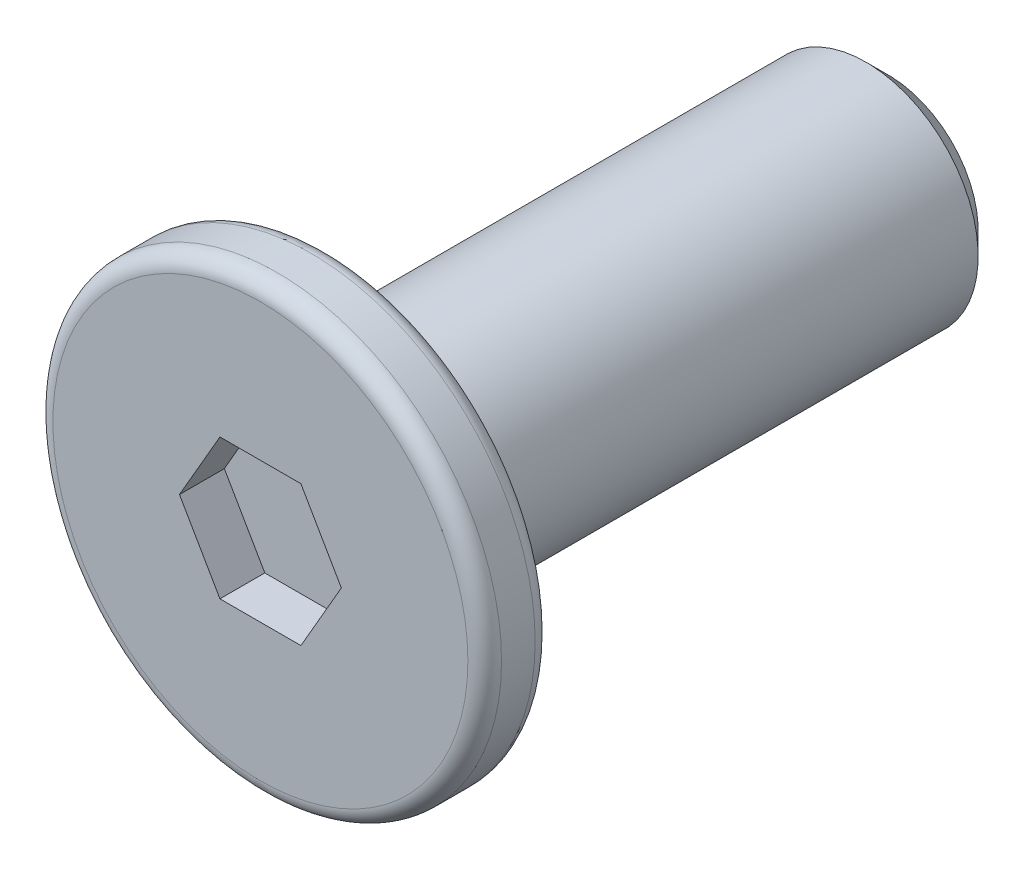
ISO-10303-21;
HEADER;
FILE_DESCRIPTION(('STEP AP214'),'2;1');
FILE_NAME('part.step','',(''),(''),'','','');
FILE_SCHEMA(('AUTOMOTIVE_DESIGN { 1 0 10303 214 1 1 1 1 }'));
ENDSEC;
DATA;
#1=APPLICATION_CONTEXT('core data for automotive mechanical design processes');
#2=APPLICATION_PROTOCOL_DEFINITION('international standard','automotive_design',2000,#1);
#3=PRODUCT_CONTEXT('',#1,'mechanical');
#4=PRODUCT('Part','Part','',(#3));
#5=PRODUCT_RELATED_PRODUCT_CATEGORY('part','',(#4));
#6=PRODUCT_DEFINITION_FORMATION('','',#4);
#7=PRODUCT_DEFINITION_CONTEXT('part definition',#1,'design');
#8=PRODUCT_DEFINITION('design','',#6,#7);
#9=PRODUCT_DEFINITION_SHAPE('','',#8);
#10=(LENGTH_UNIT() NAMED_UNIT(*) SI_UNIT(.MILLI.,.METRE.));
#11=(NAMED_UNIT(*) PLANE_ANGLE_UNIT() SI_UNIT($,.RADIAN.));
#12=(NAMED_UNIT(*) SI_UNIT($,.STERADIAN.) SOLID_ANGLE_UNIT());
#13=UNCERTAINTY_MEASURE_WITH_UNIT(LENGTH_MEASURE(1.E-05),#10,'distance_accuracy_value','');
#14=(GEOMETRIC_REPRESENTATION_CONTEXT(3) GLOBAL_UNCERTAINTY_ASSIGNED_CONTEXT((#13)) GLOBAL_UNIT_ASSIGNED_CONTEXT((#10,
#11,#12)) REPRESENTATION_CONTEXT('',''));
#15=CARTESIAN_POINT('',(0.,0.,0.));
#16=DIRECTION('',(0.,0.,1.));
#17=DIRECTION('',(1.,0.,0.));
#18=AXIS2_PLACEMENT_3D('',#15,#16,#17);
#19=CARTESIAN_POINT('',(0.,0.,0.6));
#20=DIRECTION('',(0.,0.,-1.));
#21=DIRECTION('',(-1.,0.,0.));
#22=AXIS2_PLACEMENT_3D('',#19,#20,#21);
#23=CYLINDRICAL_SURFACE('',#22,4.);
#24=CARTESIAN_POINT('',(0.,0.,-0.3));
#25=DIRECTION('',(0.,0.,1.));
#26=DIRECTION('',(1.,0.,0.));
#27=AXIS2_PLACEMENT_3D('',#24,#25,#26);
#28=CIRCLE('',#27,4.);
#29=CARTESIAN_POINT('',(4.,0.,-0.3));
#30=VERTEX_POINT('',#29);
#31=EDGE_CURVE('E154',#30,#30,#28,.T.);
#32=ORIENTED_EDGE('',*,*,#31,.T.);
#33=EDGE_LOOP('',(#32));
#34=FACE_BOUND('',#33,.T.);
#35=CARTESIAN_POINT('',(0.,0.,0.3));
#36=DIRECTION('',(0.,0.,1.));
#37=DIRECTION('',(1.,0.,0.));
#38=AXIS2_PLACEMENT_3D('',#35,#36,#37);
#39=CIRCLE('',#38,4.);
#40=CARTESIAN_POINT('',(4.,0.,0.3));
#41=VERTEX_POINT('',#40);
#42=EDGE_CURVE('E151',#41,#41,#39,.F.);
#43=ORIENTED_EDGE('',*,*,#42,.T.);
#44=EDGE_LOOP('',(#43));
#45=FACE_BOUND('',#44,.T.);
#46=ADVANCED_FACE('F35',(#34,#45),#23,.T.);
#47=CARTESIAN_POINT('',(0.,0.,0.6));
#48=DIRECTION('',(0.,0.,1.));
#49=DIRECTION('',(1.,0.,0.));
#50=AXIS2_PLACEMENT_3D('',#47,#48,#49);
#51=PLANE('',#50);
#52=CARTESIAN_POINT('',(0.,0.,0.6));
#53=DIRECTION('',(0.,0.,1.));
#54=DIRECTION('',(1.,0.,0.));
#55=AXIS2_PLACEMENT_3D('',#52,#53,#54);
#56=CIRCLE('',#55,3.7);
#57=CARTESIAN_POINT('',(3.7,0.,0.6));
#58=VERTEX_POINT('',#57);
#59=EDGE_CURVE('E11',#58,#58,#56,.T.);
#60=ORIENTED_EDGE('',*,*,#59,.T.);
#61=EDGE_LOOP('',(#60));
#62=FACE_BOUND('',#61,.T.);
#63=DIRECTION('',(0.5,0.866025403784439,0.));
#64=VECTOR('',#63,1.);
#65=CARTESIAN_POINT('',(0.721687836487033,-1.25,0.6));
#66=LINE('',#65,#64);
#67=CARTESIAN_POINT('',(0.721687836487033,-1.25,0.6));
#68=VERTEX_POINT('',#67);
#69=CARTESIAN_POINT('',(1.44337567297407,0.,0.6));
#70=VERTEX_POINT('',#69);
#71=EDGE_CURVE('E50',#68,#70,#66,.T.);
#72=ORIENTED_EDGE('',*,*,#71,.F.);
#73=DIRECTION('',(1.,0.,0.));
#74=VECTOR('',#73,1.);
#75=CARTESIAN_POINT('',(-0.721687836487031,-1.25,0.6));
#76=LINE('',#75,#74);
#77=CARTESIAN_POINT('',(-0.721687836487031,-1.25,0.6));
#78=VERTEX_POINT('',#77);
#79=EDGE_CURVE('E133',#78,#68,#76,.T.);
#80=ORIENTED_EDGE('',*,*,#79,.F.);
#81=DIRECTION('',(0.5,-0.866025403784438,0.));
#82=VECTOR('',#81,1.);
#83=CARTESIAN_POINT('',(-1.44337567297406,0.,0.6));
#84=LINE('',#83,#82);
#85=CARTESIAN_POINT('',(-1.44337567297406,0.,0.6));
#86=VERTEX_POINT('',#85);
#87=EDGE_CURVE('E131',#86,#78,#84,.T.);
#88=ORIENTED_EDGE('',*,*,#87,.F.);
#89=DIRECTION('',(-0.5,-0.866025403784439,0.));
#90=VECTOR('',#89,1.);
#91=CARTESIAN_POINT('',(-0.721687836487032,1.25,0.6));
#92=LINE('',#91,#90);
#93=CARTESIAN_POINT('',(-0.721687836487032,1.25,0.6));
#94=VERTEX_POINT('',#93);
#95=EDGE_CURVE('E98',#94,#86,#92,.T.);
#96=ORIENTED_EDGE('',*,*,#95,.F.);
#97=DIRECTION('',(-1.,0.,0.));
#98=VECTOR('',#97,1.);
#99=CARTESIAN_POINT('',(0.721687836487032,1.25,0.6));
#100=LINE('',#99,#98);
#101=CARTESIAN_POINT('',(0.721687836487032,1.25,0.6));
#102=VERTEX_POINT('',#101);
#103=EDGE_CURVE('E127',#102,#94,#100,.T.);
#104=ORIENTED_EDGE('',*,*,#103,.F.);
#105=DIRECTION('',(-0.500000000000001,0.866025403784438,0.));
#106=VECTOR('',#105,1.);
#107=CARTESIAN_POINT('',(1.44337567297407,0.,0.6));
#108=LINE('',#107,#106);
#109=EDGE_CURVE('E124',#70,#102,#108,.T.);
#110=ORIENTED_EDGE('',*,*,#109,.F.);
#111=EDGE_LOOP('',(#72,#80,#88,#96,#104,#110));
#112=FACE_BOUND('',#111,.T.);
#113=ADVANCED_FACE('F169',(#62,#112),#51,.T.);
#114=CARTESIAN_POINT('',(0.,0.,-0.6));
#115=DIRECTION('',(0.,0.,1.));
#116=DIRECTION('',(1.,0.,0.));
#117=AXIS2_PLACEMENT_3D('',#114,#115,#116);
#118=PLANE('',#117);
#119=CARTESIAN_POINT('',(0.,0.,-0.6));
#120=DIRECTION('',(0.,0.,1.));
#121=DIRECTION('',(1.,0.,0.));
#122=AXIS2_PLACEMENT_3D('',#119,#120,#121);
#123=CIRCLE('',#122,3.7);
#124=CARTESIAN_POINT('',(3.7,0.,-0.6));
#125=VERTEX_POINT('',#124);
#126=EDGE_CURVE('E43',#125,#125,#123,.F.);
#127=ORIENTED_EDGE('',*,*,#126,.T.);
#128=EDGE_LOOP('',(#127));
#129=FACE_BOUND('',#128,.T.);
#130=CARTESIAN_POINT('',(0.,0.,-0.6));
#131=DIRECTION('',(0.,0.,-1.));
#132=DIRECTION('',(-1.,0.,0.));
#133=AXIS2_PLACEMENT_3D('',#130,#131,#132);
#134=CIRCLE('',#133,2.);
#135=CARTESIAN_POINT('',(-2.,0.,-0.6));
#136=VERTEX_POINT('',#135);
#137=EDGE_CURVE('E137',#136,#136,#134,.T.);
#138=ORIENTED_EDGE('',*,*,#137,.F.);
#139=EDGE_LOOP('',(#138));
#140=FACE_BOUND('',#139,.T.);
#141=ADVANCED_FACE('F159',(#129,#140),#118,.F.);
#142=CARTESIAN_POINT('',(0.,0.,-10.6));
#143=DIRECTION('',(0.,0.,1.));
#144=DIRECTION('',(1.,0.,0.));
#145=AXIS2_PLACEMENT_3D('',#142,#143,#144);
#146=CYLINDRICAL_SURFACE('',#145,2.);
#147=CARTESIAN_POINT('',(0.,0.,-10.2));
#148=DIRECTION('',(0.,0.,-1.));
#149=DIRECTION('',(-1.,0.,0.));
#150=AXIS2_PLACEMENT_3D('',#147,#148,#149);
#151=CIRCLE('',#150,2.);
#152=CARTESIAN_POINT('',(-2.,0.,-10.2));
#153=VERTEX_POINT('',#152);
#154=EDGE_CURVE('E148',#153,#153,#151,.F.);
#155=ORIENTED_EDGE('',*,*,#154,.T.);
#156=EDGE_LOOP('',(#155));
#157=FACE_BOUND('',#156,.T.);
#158=ORIENTED_EDGE('',*,*,#137,.T.);
#159=EDGE_LOOP('',(#158));
#160=FACE_BOUND('',#159,.T.);
#161=ADVANCED_FACE('F204',(#157,#160),#146,.T.);
#162=CARTESIAN_POINT('',(0.,0.,-10.6));
#163=DIRECTION('',(0.,0.,-1.));
#164=DIRECTION('',(-1.,0.,0.));
#165=AXIS2_PLACEMENT_3D('',#162,#163,#164);
#166=PLANE('',#165);
#167=CARTESIAN_POINT('',(0.,0.,-10.6));
#168=DIRECTION('',(0.,0.,-1.));
#169=DIRECTION('',(-1.,0.,0.));
#170=AXIS2_PLACEMENT_3D('',#167,#168,#169);
#171=CIRCLE('',#170,1.6);
#172=CARTESIAN_POINT('',(-1.6,0.,-10.6));
#173=VERTEX_POINT('',#172);
#174=EDGE_CURVE('E145',#173,#173,#171,.T.);
#175=ORIENTED_EDGE('',*,*,#174,.T.);
#176=EDGE_LOOP('',(#175));
#177=FACE_BOUND('',#176,.T.);
#178=ADVANCED_FACE('F196',(#177),#166,.T.);
#179=CARTESIAN_POINT('',(0.,0.,-10.6));
#180=DIRECTION('',(0.,0.,1.));
#181=DIRECTION('',(1.,0.,0.));
#182=AXIS2_PLACEMENT_3D('',#179,#180,#181);
#183=CONICAL_SURFACE('',#182,1.6,0.785398163397446);
#184=ORIENTED_EDGE('',*,*,#154,.F.);
#185=EDGE_LOOP('',(#184));
#186=FACE_BOUND('',#185,.T.);
#187=ORIENTED_EDGE('',*,*,#174,.F.);
#188=EDGE_LOOP('',(#187));
#189=FACE_BOUND('',#188,.T.);
#190=ADVANCED_FACE('F189',(#186,#189),#183,.T.);
#191=CARTESIAN_POINT('',(0.721687836487033,-1.25,-0.2));
#192=DIRECTION('',(0.866025403784439,-0.5,0.));
#193=DIRECTION('',(0.5,0.866025403784439,0.));
#194=AXIS2_PLACEMENT_3D('',#191,#192,#193);
#195=PLANE('',#194);
#196=ORIENTED_EDGE('',*,*,#71,.T.);
#197=DIRECTION('',(0.,0.,1.));
#198=VECTOR('',#197,1.);
#199=CARTESIAN_POINT('',(1.44337567297407,0.,-0.2));
#200=LINE('',#199,#198);
#201=CARTESIAN_POINT('',(1.44337567297407,0.,-0.2));
#202=VERTEX_POINT('',#201);
#203=EDGE_CURVE('E80',#202,#70,#200,.T.);
#204=ORIENTED_EDGE('',*,*,#203,.F.);
#205=DIRECTION('',(0.5,0.866025403784439,0.));
#206=VECTOR('',#205,1.);
#207=CARTESIAN_POINT('',(0.721687836487033,-1.25,-0.2));
#208=LINE('',#207,#206);
#209=CARTESIAN_POINT('',(0.721687836487033,-1.25,-0.2));
#210=VERTEX_POINT('',#209);
#211=EDGE_CURVE('E135',#210,#202,#208,.T.);
#212=ORIENTED_EDGE('',*,*,#211,.F.);
#213=DIRECTION('',(0.,0.,1.));
#214=VECTOR('',#213,1.);
#215=CARTESIAN_POINT('',(0.721687836487033,-1.25,-0.2));
#216=LINE('',#215,#214);
#217=EDGE_CURVE('E58',#210,#68,#216,.T.);
#218=ORIENTED_EDGE('',*,*,#217,.T.);
#219=EDGE_LOOP('',(#196,#204,#212,#218));
#220=FACE_BOUND('',#219,.T.);
#221=ADVANCED_FACE('F186',(#220),#195,.F.);
#222=CARTESIAN_POINT('',(-0.721687836487031,-1.25,-0.2));
#223=DIRECTION('',(0.,-1.,0.));
#224=DIRECTION('',(0.,0.,-1.));
#225=AXIS2_PLACEMENT_3D('',#222,#223,#224);
#226=PLANE('',#225);
#227=ORIENTED_EDGE('',*,*,#79,.T.);
#228=ORIENTED_EDGE('',*,*,#217,.F.);
#229=DIRECTION('',(1.,0.,0.));
#230=VECTOR('',#229,1.);
#231=CARTESIAN_POINT('',(-0.721687836487031,-1.25,-0.2));
#232=LINE('',#231,#230);
#233=CARTESIAN_POINT('',(-0.721687836487031,-1.25,-0.2));
#234=VERTEX_POINT('',#233);
#235=EDGE_CURVE('E110',#234,#210,#232,.T.);
#236=ORIENTED_EDGE('',*,*,#235,.F.);
#237=DIRECTION('',(0.,0.,1.));
#238=VECTOR('',#237,1.);
#239=CARTESIAN_POINT('',(-0.721687836487031,-1.25,-0.2));
#240=LINE('',#239,#238);
#241=EDGE_CURVE('E102',#234,#78,#240,.T.);
#242=ORIENTED_EDGE('',*,*,#241,.T.);
#243=EDGE_LOOP('',(#227,#228,#236,#242));
#244=FACE_BOUND('',#243,.T.);
#245=ADVANCED_FACE('F188',(#244),#226,.F.);
#246=CARTESIAN_POINT('',(-1.44337567297406,0.,-0.2));
#247=DIRECTION('',(-0.866025403784438,-0.5,0.));
#248=DIRECTION('',(0.5,-0.866025403784438,0.));
#249=AXIS2_PLACEMENT_3D('',#246,#247,#248);
#250=PLANE('',#249);
#251=ORIENTED_EDGE('',*,*,#87,.T.);
#252=ORIENTED_EDGE('',*,*,#241,.F.);
#253=DIRECTION('',(0.5,-0.866025403784438,0.));
#254=VECTOR('',#253,1.);
#255=CARTESIAN_POINT('',(-1.44337567297406,0.,-0.2));
#256=LINE('',#255,#254);
#257=CARTESIAN_POINT('',(-1.44337567297406,0.,-0.2));
#258=VERTEX_POINT('',#257);
#259=EDGE_CURVE('E106',#258,#234,#256,.T.);
#260=ORIENTED_EDGE('',*,*,#259,.F.);
#261=DIRECTION('',(0.,0.,1.));
#262=VECTOR('',#261,1.);
#263=CARTESIAN_POINT('',(-1.44337567297406,0.,-0.2));
#264=LINE('',#263,#262);
#265=EDGE_CURVE('E91',#258,#86,#264,.T.);
#266=ORIENTED_EDGE('',*,*,#265,.T.);
#267=EDGE_LOOP('',(#251,#252,#260,#266));
#268=FACE_BOUND('',#267,.T.);
#269=ADVANCED_FACE('F107',(#268),#250,.F.);
#270=CARTESIAN_POINT('',(-0.721687836487032,1.25,-0.2));
#271=DIRECTION('',(-0.866025403784439,0.5,0.));
#272=DIRECTION('',(-0.5,-0.866025403784439,0.));
#273=AXIS2_PLACEMENT_3D('',#270,#271,#272);
#274=PLANE('',#273);
#275=ORIENTED_EDGE('',*,*,#95,.T.);
#276=ORIENTED_EDGE('',*,*,#265,.F.);
#277=DIRECTION('',(-0.5,-0.866025403784439,0.));
#278=VECTOR('',#277,1.);
#279=CARTESIAN_POINT('',(-0.721687836487032,1.25,-0.2));
#280=LINE('',#279,#278);
#281=CARTESIAN_POINT('',(-0.721687836487032,1.25,-0.2));
#282=VERTEX_POINT('',#281);
#283=EDGE_CURVE('E95',#282,#258,#280,.T.);
#284=ORIENTED_EDGE('',*,*,#283,.F.);
#285=DIRECTION('',(0.,0.,1.));
#286=VECTOR('',#285,1.);
#287=CARTESIAN_POINT('',(-0.721687836487032,1.25,-0.2));
#288=LINE('',#287,#286);
#289=EDGE_CURVE('E103',#282,#94,#288,.T.);
#290=ORIENTED_EDGE('',*,*,#289,.T.);
#291=EDGE_LOOP('',(#275,#276,#284,#290));
#292=FACE_BOUND('',#291,.T.);
#293=ADVANCED_FACE('F93',(#292),#274,.F.);
#294=CARTESIAN_POINT('',(0.721687836487032,1.25,-0.2));
#295=DIRECTION('',(0.,1.,0.));
#296=DIRECTION('',(0.,0.,1.));
#297=AXIS2_PLACEMENT_3D('',#294,#295,#296);
#298=PLANE('',#297);
#299=ORIENTED_EDGE('',*,*,#103,.T.);
#300=ORIENTED_EDGE('',*,*,#289,.F.);
#301=DIRECTION('',(-1.,0.,0.));
#302=VECTOR('',#301,1.);
#303=CARTESIAN_POINT('',(0.721687836487032,1.25,-0.2));
#304=LINE('',#303,#302);
#305=CARTESIAN_POINT('',(0.721687836487032,1.25,-0.2));
#306=VERTEX_POINT('',#305);
#307=EDGE_CURVE('E116',#306,#282,#304,.T.);
#308=ORIENTED_EDGE('',*,*,#307,.F.);
#309=DIRECTION('',(0.,0.,1.));
#310=VECTOR('',#309,1.);
#311=CARTESIAN_POINT('',(0.721687836487032,1.25,-0.2));
#312=LINE('',#311,#310);
#313=EDGE_CURVE('E140',#306,#102,#312,.T.);
#314=ORIENTED_EDGE('',*,*,#313,.T.);
#315=EDGE_LOOP('',(#299,#300,#308,#314));
#316=FACE_BOUND('',#315,.T.);
#317=ADVANCED_FACE('F257',(#316),#298,.F.);
#318=CARTESIAN_POINT('',(1.44337567297407,0.,-0.2));
#319=DIRECTION('',(0.866025403784438,0.500000000000001,0.));
#320=DIRECTION('',(-0.500000000000001,0.866025403784438,0.));
#321=AXIS2_PLACEMENT_3D('',#318,#319,#320);
#322=PLANE('',#321);
#323=ORIENTED_EDGE('',*,*,#109,.T.);
#324=ORIENTED_EDGE('',*,*,#313,.F.);
#325=DIRECTION('',(-0.500000000000001,0.866025403784438,0.));
#326=VECTOR('',#325,1.);
#327=CARTESIAN_POINT('',(1.44337567297407,0.,-0.2));
#328=LINE('',#327,#326);
#329=EDGE_CURVE('E118',#202,#306,#328,.T.);
#330=ORIENTED_EDGE('',*,*,#329,.F.);
#331=ORIENTED_EDGE('',*,*,#203,.T.);
#332=EDGE_LOOP('',(#323,#324,#330,#331));
#333=FACE_BOUND('',#332,.T.);
#334=ADVANCED_FACE('F184',(#333),#322,.F.);
#335=CARTESIAN_POINT('',(0.,0.,-0.2));
#336=DIRECTION('',(0.,0.,1.));
#337=DIRECTION('',(1.,0.,0.));
#338=AXIS2_PLACEMENT_3D('',#335,#336,#337);
#339=PLANE('',#338);
#340=ORIENTED_EDGE('',*,*,#211,.T.);
#341=ORIENTED_EDGE('',*,*,#329,.T.);
#342=ORIENTED_EDGE('',*,*,#307,.T.);
#343=ORIENTED_EDGE('',*,*,#283,.T.);
#344=ORIENTED_EDGE('',*,*,#259,.T.);
#345=ORIENTED_EDGE('',*,*,#235,.T.);
#346=EDGE_LOOP('',(#340,#341,#342,#343,#344,#345));
#347=FACE_BOUND('',#346,.T.);
#348=ADVANCED_FACE('F113',(#347),#339,.T.);
#349=CARTESIAN_POINT('',(0.,0.,-0.3));
#350=DIRECTION('',(0.,0.,1.));
#351=DIRECTION('',(1.,0.,0.));
#352=AXIS2_PLACEMENT_3D('',#349,#350,#351);
#353=TOROIDAL_SURFACE('',#352,3.7,0.3);
#354=ORIENTED_EDGE('',*,*,#126,.F.);
#355=EDGE_LOOP('',(#354));
#356=FACE_BOUND('',#355,.T.);
#357=ORIENTED_EDGE('',*,*,#31,.F.);
#358=EDGE_LOOP('',(#357));
#359=FACE_BOUND('',#358,.T.);
#360=ADVANCED_FACE('F162',(#356,#359),#353,.T.);
#361=CARTESIAN_POINT('',(0.,0.,0.3));
#362=DIRECTION('',(0.,0.,1.));
#363=DIRECTION('',(1.,0.,0.));
#364=AXIS2_PLACEMENT_3D('',#361,#362,#363);
#365=TOROIDAL_SURFACE('',#364,3.7,0.3);
#366=ORIENTED_EDGE('',*,*,#42,.F.);
#367=EDGE_LOOP('',(#366));
#368=FACE_BOUND('',#367,.T.);
#369=ORIENTED_EDGE('',*,*,#59,.F.);
#370=EDGE_LOOP('',(#369));
#371=FACE_BOUND('',#370,.T.);
#372=ADVANCED_FACE('F37',(#368,#371),#365,.T.);
#373=CLOSED_SHELL('',(#46,#113,#141,#161,#178,#190,#221,#245,#269,#293,#317,#334,#348,#360,#372));
#374=MANIFOLD_SOLID_BREP('B2',#373);
#375=ADVANCED_BREP_SHAPE_REPRESENTATION('',(#18,#374),#14);
#376=SHAPE_DEFINITION_REPRESENTATION(#9,#375);
ENDSEC;
END-ISO-10303-21;
